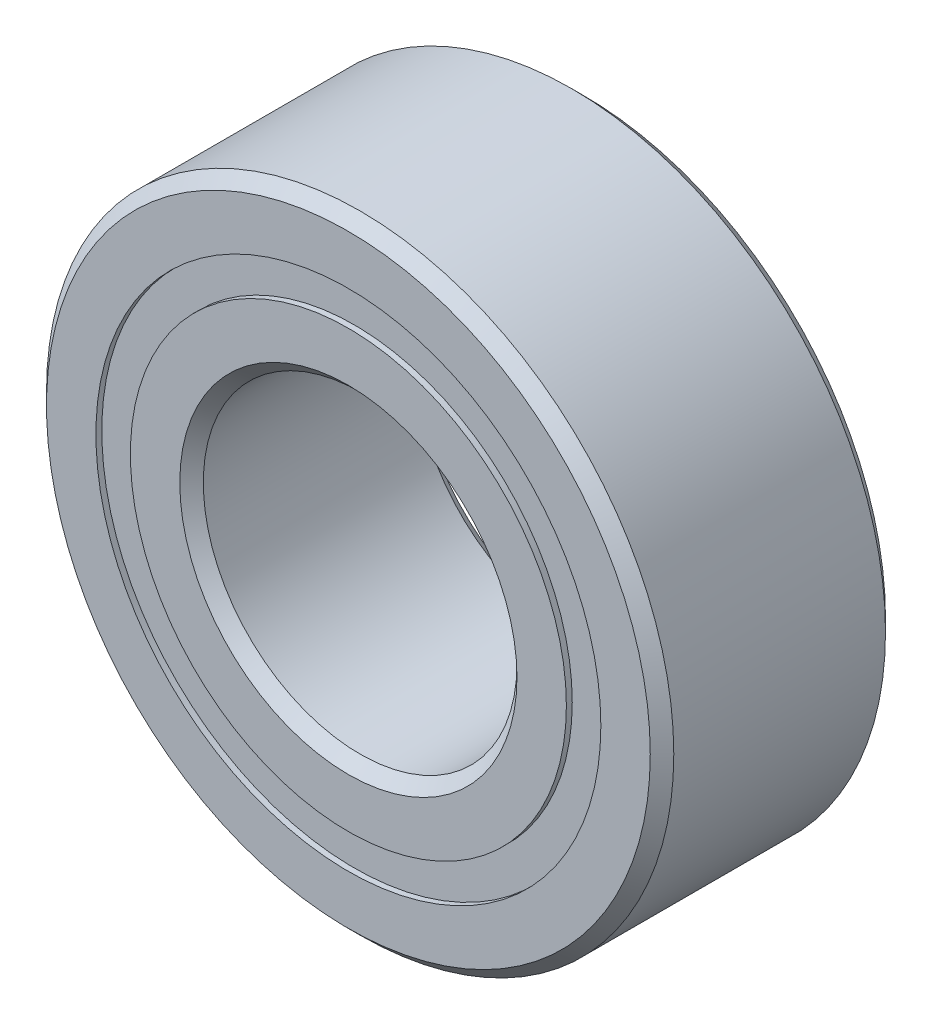
ISO-10303-21;
HEADER;
FILE_DESCRIPTION(('STEP AP214'),'2;1');
FILE_NAME('part.step','',(''),(''),'','','');
FILE_SCHEMA(('AUTOMOTIVE_DESIGN { 1 0 10303 214 1 1 1 1 }'));
ENDSEC;
DATA;
#1=APPLICATION_CONTEXT('core data for automotive mechanical design processes');
#2=APPLICATION_PROTOCOL_DEFINITION('international standard','automotive_design',2000,#1);
#3=PRODUCT_CONTEXT('',#1,'mechanical');
#4=PRODUCT('Part','Part','',(#3));
#5=PRODUCT_RELATED_PRODUCT_CATEGORY('part','',(#4));
#6=PRODUCT_DEFINITION_FORMATION('','',#4);
#7=PRODUCT_DEFINITION_CONTEXT('part definition',#1,'design');
#8=PRODUCT_DEFINITION('design','',#6,#7);
#9=PRODUCT_DEFINITION_SHAPE('','',#8);
#10=(LENGTH_UNIT() NAMED_UNIT(*) SI_UNIT(.MILLI.,.METRE.));
#11=(NAMED_UNIT(*) PLANE_ANGLE_UNIT() SI_UNIT($,.RADIAN.));
#12=(NAMED_UNIT(*) SI_UNIT($,.STERADIAN.) SOLID_ANGLE_UNIT());
#13=UNCERTAINTY_MEASURE_WITH_UNIT(LENGTH_MEASURE(1.E-05),#10,'distance_accuracy_value','');
#14=(GEOMETRIC_REPRESENTATION_CONTEXT(3) GLOBAL_UNCERTAINTY_ASSIGNED_CONTEXT((#13)) GLOBAL_UNIT_ASSIGNED_CONTEXT((#10,
#11,#12)) REPRESENTATION_CONTEXT('',''));
#15=CARTESIAN_POINT('',(0.,0.,0.));
#16=DIRECTION('',(0.,0.,1.));
#17=DIRECTION('',(1.,0.,0.));
#18=AXIS2_PLACEMENT_3D('',#15,#16,#17);
#19=CARTESIAN_POINT('',(0.,5.1114010989011,-2.2621875));
#20=DIRECTION('',(0.,0.,1.));
#21=DIRECTION('',(1.,0.,0.));
#22=AXIS2_PLACEMENT_3D('',#19,#20,#21);
#23=PLANE('',#22);
#24=CARTESIAN_POINT('',(0.,0.,-2.2621875));
#25=DIRECTION('',(0.,0.,1.));
#26=DIRECTION('',(1.,0.,0.));
#27=AXIS2_PLACEMENT_3D('',#24,#25,#26);
#28=CIRCLE('',#27,5.1114010989011);
#29=CARTESIAN_POINT('',(5.1114010989011,0.,-2.2621875));
#30=VERTEX_POINT('',#29);
#31=EDGE_CURVE('E64',#30,#30,#28,.T.);
#32=ORIENTED_EDGE('',*,*,#31,.F.);
#33=EDGE_LOOP('',(#32));
#34=FACE_BOUND('',#33,.T.);
#35=CARTESIAN_POINT('',(0.,0.,-2.2621875));
#36=DIRECTION('',(0.,0.,1.));
#37=DIRECTION('',(1.,0.,0.));
#38=AXIS2_PLACEMENT_3D('',#35,#36,#37);
#39=CIRCLE('',#38,4.4135989010989);
#40=CARTESIAN_POINT('',(4.4135989010989,0.,-2.2621875));
#41=VERTEX_POINT('',#40);
#42=EDGE_CURVE('E11',#41,#41,#39,.T.);
#43=ORIENTED_EDGE('',*,*,#42,.T.);
#44=EDGE_LOOP('',(#43));
#45=FACE_BOUND('',#44,.T.);
#46=ADVANCED_FACE('F50',(#34,#45),#23,.F.);
#47=CARTESIAN_POINT('',(0.,0.,2.38125));
#48=DIRECTION('',(0.,0.,1.));
#49=DIRECTION('',(1.,0.,0.));
#50=AXIS2_PLACEMENT_3D('',#47,#48,#49);
#51=CYLINDRICAL_SURFACE('',#50,4.4135989010989);
#52=ORIENTED_EDGE('',*,*,#42,.F.);
#53=EDGE_LOOP('',(#52));
#54=FACE_BOUND('',#53,.T.);
#55=CARTESIAN_POINT('',(0.,0.,-1.11436144103197));
#56=DIRECTION('',(0.,0.,1.));
#57=DIRECTION('',(1.,0.,0.));
#58=AXIS2_PLACEMENT_3D('',#55,#56,#57);
#59=CIRCLE('',#58,4.4135989010989);
#60=CARTESIAN_POINT('',(4.4135989010989,0.,-1.11436144103197));
#61=VERTEX_POINT('',#60);
#62=EDGE_CURVE('E56',#61,#61,#59,.T.);
#63=ORIENTED_EDGE('',*,*,#62,.T.);
#64=EDGE_LOOP('',(#63));
#65=FACE_BOUND('',#64,.T.);
#66=ADVANCED_FACE('F73',(#54,#65),#51,.F.);
#67=CARTESIAN_POINT('',(0.,5.1114010989011,-1.11436144103197));
#68=DIRECTION('',(0.,0.,-1.));
#69=DIRECTION('',(-1.,0.,0.));
#70=AXIS2_PLACEMENT_3D('',#67,#68,#69);
#71=PLANE('',#70);
#72=ORIENTED_EDGE('',*,*,#62,.F.);
#73=EDGE_LOOP('',(#72));
#74=FACE_BOUND('',#73,.T.);
#75=CARTESIAN_POINT('',(0.,0.,-1.11436144103197));
#76=DIRECTION('',(0.,0.,1.));
#77=DIRECTION('',(1.,0.,0.));
#78=AXIS2_PLACEMENT_3D('',#75,#76,#77);
#79=CIRCLE('',#78,5.1114010989011);
#80=CARTESIAN_POINT('',(5.1114010989011,0.,-1.11436144103197));
#81=VERTEX_POINT('',#80);
#82=EDGE_CURVE('E60',#81,#81,#79,.T.);
#83=ORIENTED_EDGE('',*,*,#82,.T.);
#84=EDGE_LOOP('',(#83));
#85=FACE_BOUND('',#84,.T.);
#86=ADVANCED_FACE('F77',(#74,#85),#71,.F.);
#87=CARTESIAN_POINT('',(0.,0.,2.38125));
#88=DIRECTION('',(0.,0.,1.));
#89=DIRECTION('',(1.,0.,0.));
#90=AXIS2_PLACEMENT_3D('',#87,#88,#89);
#91=CYLINDRICAL_SURFACE('',#90,5.1114010989011);
#92=ORIENTED_EDGE('',*,*,#82,.F.);
#93=EDGE_LOOP('',(#92));
#94=FACE_BOUND('',#93,.T.);
#95=ORIENTED_EDGE('',*,*,#31,.T.);
#96=EDGE_LOOP('',(#95));
#97=FACE_BOUND('',#96,.T.);
#98=ADVANCED_FACE('F70',(#94,#97),#91,.T.);
#99=CLOSED_SHELL('',(#46,#66,#86,#98));
#100=MANIFOLD_SOLID_BREP('B2',#99);
#101=CARTESIAN_POINT('',(0.,5.1114010989011,2.2621875));
#102=DIRECTION('',(0.,0.,-1.));
#103=DIRECTION('',(-1.,0.,0.));
#104=AXIS2_PLACEMENT_3D('',#101,#102,#103);
#105=PLANE('',#104);
#106=CARTESIAN_POINT('',(0.,0.,2.2621875));
#107=DIRECTION('',(0.,0.,1.));
#108=DIRECTION('',(1.,0.,0.));
#109=AXIS2_PLACEMENT_3D('',#106,#107,#108);
#110=CIRCLE('',#109,4.4135989010989);
#111=CARTESIAN_POINT('',(4.4135989010989,0.,2.2621875));
#112=VERTEX_POINT('',#111);
#113=EDGE_CURVE('E49',#112,#112,#110,.T.);
#114=ORIENTED_EDGE('',*,*,#113,.F.);
#115=EDGE_LOOP('',(#114));
#116=FACE_BOUND('',#115,.T.);
#117=CARTESIAN_POINT('',(0.,0.,2.2621875));
#118=DIRECTION('',(0.,0.,1.));
#119=DIRECTION('',(1.,0.,0.));
#120=AXIS2_PLACEMENT_3D('',#117,#118,#119);
#121=CIRCLE('',#120,5.1114010989011);
#122=CARTESIAN_POINT('',(5.1114010989011,0.,2.2621875));
#123=VERTEX_POINT('',#122);
#124=EDGE_CURVE('E124',#123,#123,#121,.T.);
#125=ORIENTED_EDGE('',*,*,#124,.T.);
#126=EDGE_LOOP('',(#125));
#127=FACE_BOUND('',#126,.T.);
#128=ADVANCED_FACE('F110',(#116,#127),#105,.F.);
#129=CARTESIAN_POINT('',(0.,0.,2.38125));
#130=DIRECTION('',(0.,0.,1.));
#131=DIRECTION('',(1.,0.,0.));
#132=AXIS2_PLACEMENT_3D('',#129,#130,#131);
#133=CYLINDRICAL_SURFACE('',#132,4.4135989010989);
#134=CARTESIAN_POINT('',(0.,0.,1.11436144103197));
#135=DIRECTION('',(0.,0.,1.));
#136=DIRECTION('',(1.,0.,0.));
#137=AXIS2_PLACEMENT_3D('',#134,#135,#136);
#138=CIRCLE('',#137,4.4135989010989);
#139=CARTESIAN_POINT('',(4.4135989010989,0.,1.11436144103197));
#140=VERTEX_POINT('',#139);
#141=EDGE_CURVE('E116',#140,#140,#138,.T.);
#142=ORIENTED_EDGE('',*,*,#141,.F.);
#143=EDGE_LOOP('',(#142));
#144=FACE_BOUND('',#143,.T.);
#145=ORIENTED_EDGE('',*,*,#113,.T.);
#146=EDGE_LOOP('',(#145));
#147=FACE_BOUND('',#146,.T.);
#148=ADVANCED_FACE('F139',(#144,#147),#133,.F.);
#149=CARTESIAN_POINT('',(0.,5.1114010989011,1.11436144103197));
#150=DIRECTION('',(0.,0.,1.));
#151=DIRECTION('',(1.,0.,0.));
#152=AXIS2_PLACEMENT_3D('',#149,#150,#151);
#153=PLANE('',#152);
#154=CARTESIAN_POINT('',(0.,0.,1.11436144103197));
#155=DIRECTION('',(0.,0.,1.));
#156=DIRECTION('',(1.,0.,0.));
#157=AXIS2_PLACEMENT_3D('',#154,#155,#156);
#158=CIRCLE('',#157,5.1114010989011);
#159=CARTESIAN_POINT('',(5.1114010989011,0.,1.11436144103197));
#160=VERTEX_POINT('',#159);
#161=EDGE_CURVE('E120',#160,#160,#158,.T.);
#162=ORIENTED_EDGE('',*,*,#161,.F.);
#163=EDGE_LOOP('',(#162));
#164=FACE_BOUND('',#163,.T.);
#165=ORIENTED_EDGE('',*,*,#141,.T.);
#166=EDGE_LOOP('',(#165));
#167=FACE_BOUND('',#166,.T.);
#168=ADVANCED_FACE('F134',(#164,#167),#153,.F.);
#169=CARTESIAN_POINT('',(0.,0.,2.38125));
#170=DIRECTION('',(0.,0.,1.));
#171=DIRECTION('',(1.,0.,0.));
#172=AXIS2_PLACEMENT_3D('',#169,#170,#171);
#173=CYLINDRICAL_SURFACE('',#172,5.1114010989011);
#174=ORIENTED_EDGE('',*,*,#124,.F.);
#175=EDGE_LOOP('',(#174));
#176=FACE_BOUND('',#175,.T.);
#177=ORIENTED_EDGE('',*,*,#161,.T.);
#178=EDGE_LOOP('',(#177));
#179=FACE_BOUND('',#178,.T.);
#180=ADVANCED_FACE('F131',(#176,#179),#173,.T.);
#181=CLOSED_SHELL('',(#128,#148,#168,#180));
#182=MANIFOLD_SOLID_BREP('B6',#181);
#183=CARTESIAN_POINT('',(-2.38124999999995,4.12444598552342,0.));
#184=DIRECTION('',(0.,0.,1.));
#185=DIRECTION('',(-0.499999999999989,0.866025403784445,0.));
#186=AXIS2_PLACEMENT_3D('',#183,#184,#185);
#187=SPHERICAL_SURFACE('',#186,1.11436144103197);
#188=CARTESIAN_POINT('',(-2.38124999999995,4.12444598552342,1.11436144103197));
#189=VERTEX_POINT('',#188);
#190=VERTEX_LOOP('',#189);
#191=FACE_BOUND('',#190,.T.);
#192=ADVANCED_FACE('F170',(#191),#187,.T.);
#193=CLOSED_SHELL('',(#192));
#194=MANIFOLD_SOLID_BREP('B44',#193);
#195=CARTESIAN_POINT('',(-4.12444598552336,2.38125000000005,0.));
#196=DIRECTION('',(0.,0.,1.));
#197=DIRECTION('',(-0.866025403784433,0.50000000000001,0.));
#198=AXIS2_PLACEMENT_3D('',#195,#196,#197);
#199=SPHERICAL_SURFACE('',#198,1.11436144103197);
#200=CARTESIAN_POINT('',(-4.12444598552336,2.38125000000005,1.11436144103197));
#201=VERTEX_POINT('',#200);
#202=VERTEX_LOOP('',#201);
#203=FACE_BOUND('',#202,.T.);
#204=ADVANCED_FACE('F193',(#203),#199,.T.);
#205=CLOSED_SHELL('',(#204));
#206=MANIFOLD_SOLID_BREP('B106',#205);
#207=CARTESIAN_POINT('',(-4.7625,0.,0.));
#208=DIRECTION('',(0.,0.,1.));
#209=DIRECTION('',(-1.,0.,0.));
#210=AXIS2_PLACEMENT_3D('',#207,#208,#209);
#211=SPHERICAL_SURFACE('',#210,1.11436144103197);
#212=CARTESIAN_POINT('',(-4.7625,0.,1.11436144103197));
#213=VERTEX_POINT('',#212);
#214=VERTEX_LOOP('',#213);
#215=FACE_BOUND('',#214,.T.);
#216=ADVANCED_FACE('F216',(#215),#211,.T.);
#217=CLOSED_SHELL('',(#216));
#218=MANIFOLD_SOLID_BREP('B166',#217);
#219=CARTESIAN_POINT('',(-4.12444598552341,-2.38124999999996,0.));
#220=DIRECTION('',(0.,0.,1.));
#221=DIRECTION('',(-0.866025403784443,-0.499999999999992,0.));
#222=AXIS2_PLACEMENT_3D('',#219,#220,#221);
#223=SPHERICAL_SURFACE('',#222,1.11436144103197);
#224=CARTESIAN_POINT('',(-4.12444598552341,-2.38124999999996,1.11436144103197));
#225=VERTEX_POINT('',#224);
#226=VERTEX_LOOP('',#225);
#227=FACE_BOUND('',#226,.T.);
#228=ADVANCED_FACE('F239',(#227),#223,.T.);
#229=CLOSED_SHELL('',(#228));
#230=MANIFOLD_SOLID_BREP('B189',#229);
#231=CARTESIAN_POINT('',(-2.38125000000003,-4.12444598552337,0.));
#232=DIRECTION('',(0.,0.,1.));
#233=DIRECTION('',(-0.500000000000007,-0.866025403784435,0.));
#234=AXIS2_PLACEMENT_3D('',#231,#232,#233);
#235=SPHERICAL_SURFACE('',#234,1.11436144103197);
#236=CARTESIAN_POINT('',(-2.38125000000003,-4.12444598552337,1.11436144103197));
#237=VERTEX_POINT('',#236);
#238=VERTEX_LOOP('',#237);
#239=FACE_BOUND('',#238,.T.);
#240=ADVANCED_FACE('F262',(#239),#235,.T.);
#241=CLOSED_SHELL('',(#240));
#242=MANIFOLD_SOLID_BREP('B212',#241);
#243=CARTESIAN_POINT('',(0.,-4.7625,0.));
#244=DIRECTION('',(0.,0.,1.));
#245=DIRECTION('',(0.,-1.,0.));
#246=AXIS2_PLACEMENT_3D('',#243,#244,#245);
#247=SPHERICAL_SURFACE('',#246,1.11436144103197);
#248=CARTESIAN_POINT('',(0.,-4.7625,1.11436144103197));
#249=VERTEX_POINT('',#248);
#250=VERTEX_LOOP('',#249);
#251=FACE_BOUND('',#250,.T.);
#252=ADVANCED_FACE('F285',(#251),#247,.T.);
#253=CLOSED_SHELL('',(#252));
#254=MANIFOLD_SOLID_BREP('B235',#253);
#255=CARTESIAN_POINT('',(2.38124999999998,-4.1244459855234,0.));
#256=DIRECTION('',(0.,0.,1.));
#257=DIRECTION('',(0.499999999999995,-0.866025403784442,0.));
#258=AXIS2_PLACEMENT_3D('',#255,#256,#257);
#259=SPHERICAL_SURFACE('',#258,1.11436144103197);
#260=CARTESIAN_POINT('',(2.38124999999998,-4.1244459855234,1.11436144103197));
#261=VERTEX_POINT('',#260);
#262=VERTEX_LOOP('',#261);
#263=FACE_BOUND('',#262,.T.);
#264=ADVANCED_FACE('F308',(#263),#259,.T.);
#265=CLOSED_SHELL('',(#264));
#266=MANIFOLD_SOLID_BREP('B258',#265);
#267=CARTESIAN_POINT('',(4.12444598552338,-2.38125000000002,0.));
#268=DIRECTION('',(0.,0.,1.));
#269=DIRECTION('',(0.866025403784436,-0.500000000000004,0.));
#270=AXIS2_PLACEMENT_3D('',#267,#268,#269);
#271=SPHERICAL_SURFACE('',#270,1.11436144103197);
#272=CARTESIAN_POINT('',(4.12444598552338,-2.38125000000002,1.11436144103197));
#273=VERTEX_POINT('',#272);
#274=VERTEX_LOOP('',#273);
#275=FACE_BOUND('',#274,.T.);
#276=ADVANCED_FACE('F331',(#275),#271,.T.);
#277=CLOSED_SHELL('',(#276));
#278=MANIFOLD_SOLID_BREP('B281',#277);
#279=CARTESIAN_POINT('',(4.7625,0.,0.));
#280=DIRECTION('',(0.,0.,1.));
#281=DIRECTION('',(1.,0.,0.));
#282=AXIS2_PLACEMENT_3D('',#279,#280,#281);
#283=SPHERICAL_SURFACE('',#282,1.11436144103197);
#284=CARTESIAN_POINT('',(4.7625,0.,1.11436144103197));
#285=VERTEX_POINT('',#284);
#286=VERTEX_LOOP('',#285);
#287=FACE_BOUND('',#286,.T.);
#288=ADVANCED_FACE('F354',(#287),#283,.T.);
#289=CLOSED_SHELL('',(#288));
#290=MANIFOLD_SOLID_BREP('B304',#289);
#291=CARTESIAN_POINT('',(4.12444598552339,2.38124999999999,0.));
#292=DIRECTION('',(0.,0.,1.));
#293=DIRECTION('',(0.86602540378444,0.499999999999998,0.));
#294=AXIS2_PLACEMENT_3D('',#291,#292,#293);
#295=SPHERICAL_SURFACE('',#294,1.11436144103197);
#296=CARTESIAN_POINT('',(4.12444598552339,2.38124999999999,1.11436144103197));
#297=VERTEX_POINT('',#296);
#298=VERTEX_LOOP('',#297);
#299=FACE_BOUND('',#298,.T.);
#300=ADVANCED_FACE('F377',(#299),#295,.T.);
#301=CLOSED_SHELL('',(#300));
#302=MANIFOLD_SOLID_BREP('B327',#301);
#303=CARTESIAN_POINT('',(2.38125,4.12444598552339,0.));
#304=DIRECTION('',(0.,0.,1.));
#305=DIRECTION('',(0.500000000000001,0.866025403784438,0.));
#306=AXIS2_PLACEMENT_3D('',#303,#304,#305);
#307=SPHERICAL_SURFACE('',#306,1.11436144103197);
#308=CARTESIAN_POINT('',(2.38125,4.12444598552339,1.11436144103197));
#309=VERTEX_POINT('',#308);
#310=VERTEX_LOOP('',#309);
#311=FACE_BOUND('',#310,.T.);
#312=ADVANCED_FACE('F400',(#311),#307,.T.);
#313=CLOSED_SHELL('',(#312));
#314=MANIFOLD_SOLID_BREP('B350',#313);
#315=CARTESIAN_POINT('',(0.,4.7625,0.));
#316=DIRECTION('',(0.,0.,1.));
#317=DIRECTION('',(0.,1.,0.));
#318=AXIS2_PLACEMENT_3D('',#315,#316,#317);
#319=SPHERICAL_SURFACE('',#318,1.11436144103197);
#320=CARTESIAN_POINT('',(0.,4.7625,1.11436144103197));
#321=VERTEX_POINT('',#320);
#322=VERTEX_LOOP('',#321);
#323=FACE_BOUND('',#322,.T.);
#324=ADVANCED_FACE('F425',(#323),#319,.T.);
#325=CLOSED_SHELL('',(#324));
#326=MANIFOLD_SOLID_BREP('B373',#325);
#327=CARTESIAN_POINT('',(0.,4.4135989010989,2.38125));
#328=DIRECTION('',(0.,0.,-1.));
#329=DIRECTION('',(-1.,0.,0.));
#330=AXIS2_PLACEMENT_3D('',#327,#328,#329);
#331=PLANE('',#330);
#332=CARTESIAN_POINT('',(0.,0.,2.38125));
#333=DIRECTION('',(0.,0.,1.));
#334=DIRECTION('',(1.,0.,0.));
#335=AXIS2_PLACEMENT_3D('',#332,#333,#334);
#336=CIRCLE('',#335,3.413125);
#337=CARTESIAN_POINT('',(3.413125,0.,2.38125));
#338=VERTEX_POINT('',#337);
#339=EDGE_CURVE('E471',#338,#338,#336,.T.);
#340=ORIENTED_EDGE('',*,*,#339,.F.);
#341=EDGE_LOOP('',(#340));
#342=FACE_BOUND('',#341,.T.);
#343=CARTESIAN_POINT('',(0.,0.,2.38125));
#344=DIRECTION('',(0.,0.,1.));
#345=DIRECTION('',(1.,0.,0.));
#346=AXIS2_PLACEMENT_3D('',#343,#344,#345);
#347=CIRCLE('',#346,4.4135989010989);
#348=CARTESIAN_POINT('',(4.4135989010989,0.,2.38125));
#349=VERTEX_POINT('',#348);
#350=EDGE_CURVE('E424',#349,#349,#347,.T.);
#351=ORIENTED_EDGE('',*,*,#350,.T.);
#352=EDGE_LOOP('',(#351));
#353=FACE_BOUND('',#352,.T.);
#354=ADVANCED_FACE('F443',(#342,#353),#331,.F.);
#355=CARTESIAN_POINT('',(0.,0.,2.38125));
#356=DIRECTION('',(0.,0.,1.));
#357=DIRECTION('',(1.,0.,0.));
#358=AXIS2_PLACEMENT_3D('',#355,#356,#357);
#359=CYLINDRICAL_SURFACE('',#358,4.4135989010989);
#360=ORIENTED_EDGE('',*,*,#350,.F.);
#361=EDGE_LOOP('',(#360));
#362=FACE_BOUND('',#361,.T.);
#363=CARTESIAN_POINT('',(0.,0.,1.05833333333333));
#364=DIRECTION('',(0.,0.,1.));
#365=DIRECTION('',(1.,0.,0.));
#366=AXIS2_PLACEMENT_3D('',#363,#364,#365);
#367=CIRCLE('',#366,4.4135989010989);
#368=CARTESIAN_POINT('',(4.4135989010989,0.,1.05833333333333));
#369=VERTEX_POINT('',#368);
#370=EDGE_CURVE('E449',#369,#369,#367,.T.);
#371=ORIENTED_EDGE('',*,*,#370,.T.);
#372=EDGE_LOOP('',(#371));
#373=FACE_BOUND('',#372,.T.);
#374=ADVANCED_FACE('F478',(#362,#373),#359,.T.);
#375=CARTESIAN_POINT('',(0.,0.,0.));
#376=DIRECTION('',(0.,0.,1.));
#377=DIRECTION('',(1.,0.,0.));
#378=AXIS2_PLACEMENT_3D('',#375,#376,#377);
#379=TOROIDAL_SURFACE('',#378,4.76249999999999,1.11436144103196);
#380=ORIENTED_EDGE('',*,*,#370,.F.);
#381=EDGE_LOOP('',(#380));
#382=FACE_BOUND('',#381,.T.);
#383=CARTESIAN_POINT('',(0.,0.,-1.05833333333334));
#384=DIRECTION('',(0.,0.,1.));
#385=DIRECTION('',(1.,0.,0.));
#386=AXIS2_PLACEMENT_3D('',#383,#384,#385);
#387=CIRCLE('',#386,4.4135989010989);
#388=CARTESIAN_POINT('',(4.4135989010989,0.,-1.05833333333334));
#389=VERTEX_POINT('',#388);
#390=EDGE_CURVE('E453',#389,#389,#387,.T.);
#391=ORIENTED_EDGE('',*,*,#390,.T.);
#392=EDGE_LOOP('',(#391));
#393=FACE_BOUND('',#392,.T.);
#394=ADVANCED_FACE('F482',(#382,#393),#379,.F.);
#395=CARTESIAN_POINT('',(0.,0.,2.38125));
#396=DIRECTION('',(0.,0.,1.));
#397=DIRECTION('',(1.,0.,0.));
#398=AXIS2_PLACEMENT_3D('',#395,#396,#397);
#399=CYLINDRICAL_SURFACE('',#398,4.4135989010989);
#400=ORIENTED_EDGE('',*,*,#390,.F.);
#401=EDGE_LOOP('',(#400));
#402=FACE_BOUND('',#401,.T.);
#403=CARTESIAN_POINT('',(0.,0.,-2.38125));
#404=DIRECTION('',(0.,0.,1.));
#405=DIRECTION('',(1.,0.,0.));
#406=AXIS2_PLACEMENT_3D('',#403,#404,#405);
#407=CIRCLE('',#406,4.4135989010989);
#408=CARTESIAN_POINT('',(4.4135989010989,0.,-2.38125));
#409=VERTEX_POINT('',#408);
#410=EDGE_CURVE('E457',#409,#409,#407,.T.);
#411=ORIENTED_EDGE('',*,*,#410,.T.);
#412=EDGE_LOOP('',(#411));
#413=FACE_BOUND('',#412,.T.);
#414=ADVANCED_FACE('F487',(#402,#413),#399,.T.);
#415=CARTESIAN_POINT('',(0.,3.413125,-2.38125));
#416=DIRECTION('',(0.,0.,1.));
#417=DIRECTION('',(1.,0.,0.));
#418=AXIS2_PLACEMENT_3D('',#415,#416,#417);
#419=PLANE('',#418);
#420=ORIENTED_EDGE('',*,*,#410,.F.);
#421=EDGE_LOOP('',(#420));
#422=FACE_BOUND('',#421,.T.);
#423=CARTESIAN_POINT('',(0.,0.,-2.38125));
#424=DIRECTION('',(0.,0.,1.));
#425=DIRECTION('',(1.,0.,0.));
#426=AXIS2_PLACEMENT_3D('',#423,#424,#425);
#427=CIRCLE('',#426,3.413125);
#428=CARTESIAN_POINT('',(3.413125,0.,-2.38125));
#429=VERTEX_POINT('',#428);
#430=EDGE_CURVE('E462',#429,#429,#427,.T.);
#431=ORIENTED_EDGE('',*,*,#430,.T.);
#432=EDGE_LOOP('',(#431));
#433=FACE_BOUND('',#432,.T.);
#434=ADVANCED_FACE('F493',(#422,#433),#419,.F.);
#435=CARTESIAN_POINT('',(0.,0.,-2.143125));
#436=DIRECTION('',(0.,0.,-1.));
#437=DIRECTION('',(-1.,0.,0.));
#438=AXIS2_PLACEMENT_3D('',#435,#436,#437);
#439=CONICAL_SURFACE('',#438,3.175,0.785398163397451);
#440=ORIENTED_EDGE('',*,*,#430,.F.);
#441=EDGE_LOOP('',(#440));
#442=FACE_BOUND('',#441,.T.);
#443=CARTESIAN_POINT('',(0.,0.,-2.143125));
#444=DIRECTION('',(0.,0.,1.));
#445=DIRECTION('',(1.,0.,0.));
#446=AXIS2_PLACEMENT_3D('',#443,#444,#445);
#447=CIRCLE('',#446,3.175);
#448=CARTESIAN_POINT('',(3.175,0.,-2.143125));
#449=VERTEX_POINT('',#448);
#450=EDGE_CURVE('E465',#449,#449,#447,.T.);
#451=ORIENTED_EDGE('',*,*,#450,.T.);
#452=EDGE_LOOP('',(#451));
#453=FACE_BOUND('',#452,.T.);
#454=ADVANCED_FACE('F497',(#442,#453),#439,.F.);
#455=CARTESIAN_POINT('',(0.,0.,2.38125));
#456=DIRECTION('',(0.,0.,1.));
#457=DIRECTION('',(1.,0.,0.));
#458=AXIS2_PLACEMENT_3D('',#455,#456,#457);
#459=CYLINDRICAL_SURFACE('',#458,3.175);
#460=ORIENTED_EDGE('',*,*,#450,.F.);
#461=EDGE_LOOP('',(#460));
#462=FACE_BOUND('',#461,.T.);
#463=CARTESIAN_POINT('',(0.,0.,2.143125));
#464=DIRECTION('',(0.,0.,1.));
#465=DIRECTION('',(1.,0.,0.));
#466=AXIS2_PLACEMENT_3D('',#463,#464,#465);
#467=CIRCLE('',#466,3.175);
#468=CARTESIAN_POINT('',(3.175,0.,2.143125));
#469=VERTEX_POINT('',#468);
#470=EDGE_CURVE('E468',#469,#469,#467,.T.);
#471=ORIENTED_EDGE('',*,*,#470,.T.);
#472=EDGE_LOOP('',(#471));
#473=FACE_BOUND('',#472,.T.);
#474=ADVANCED_FACE('F501',(#462,#473),#459,.F.);
#475=CARTESIAN_POINT('',(0.,0.,2.38125));
#476=DIRECTION('',(0.,0.,1.));
#477=DIRECTION('',(1.,0.,0.));
#478=AXIS2_PLACEMENT_3D('',#475,#476,#477);
#479=CONICAL_SURFACE('',#478,3.413125,0.785398163397446);
#480=ORIENTED_EDGE('',*,*,#470,.F.);
#481=EDGE_LOOP('',(#480));
#482=FACE_BOUND('',#481,.T.);
#483=ORIENTED_EDGE('',*,*,#339,.T.);
#484=EDGE_LOOP('',(#483));
#485=FACE_BOUND('',#484,.T.);
#486=ADVANCED_FACE('F475',(#482,#485),#479,.F.);
#487=CLOSED_SHELL('',(#354,#374,#394,#414,#434,#454,#474,#486));
#488=MANIFOLD_SOLID_BREP('B396',#487);
#489=CARTESIAN_POINT('',(0.,0.,2.143125));
#490=DIRECTION('',(0.,0.,-1.));
#491=DIRECTION('',(-1.,0.,0.));
#492=AXIS2_PLACEMENT_3D('',#489,#490,#491);
#493=CONICAL_SURFACE('',#492,6.35,0.785398163397447);
#494=CARTESIAN_POINT('',(0.,0.,2.38125));
#495=DIRECTION('',(0.,0.,1.));
#496=DIRECTION('',(1.,0.,0.));
#497=AXIS2_PLACEMENT_3D('',#494,#495,#496);
#498=CIRCLE('',#497,6.111875);
#499=CARTESIAN_POINT('',(6.111875,0.,2.38125));
#500=VERTEX_POINT('',#499);
#501=EDGE_CURVE('E577',#500,#500,#498,.T.);
#502=ORIENTED_EDGE('',*,*,#501,.F.);
#503=EDGE_LOOP('',(#502));
#504=FACE_BOUND('',#503,.T.);
#505=CARTESIAN_POINT('',(0.,0.,2.143125));
#506=DIRECTION('',(0.,0.,1.));
#507=DIRECTION('',(1.,0.,0.));
#508=AXIS2_PLACEMENT_3D('',#505,#506,#507);
#509=CIRCLE('',#508,6.35);
#510=CARTESIAN_POINT('',(6.35,0.,2.143125));
#511=VERTEX_POINT('',#510);
#512=EDGE_CURVE('E442',#511,#511,#509,.T.);
#513=ORIENTED_EDGE('',*,*,#512,.T.);
#514=EDGE_LOOP('',(#513));
#515=FACE_BOUND('',#514,.T.);
#516=ADVANCED_FACE('F549',(#504,#515),#493,.T.);
#517=CARTESIAN_POINT('',(0.,0.,2.38125));
#518=DIRECTION('',(0.,0.,1.));
#519=DIRECTION('',(1.,0.,0.));
#520=AXIS2_PLACEMENT_3D('',#517,#518,#519);
#521=CYLINDRICAL_SURFACE('',#520,6.35);
#522=ORIENTED_EDGE('',*,*,#512,.F.);
#523=EDGE_LOOP('',(#522));
#524=FACE_BOUND('',#523,.T.);
#525=CARTESIAN_POINT('',(0.,0.,-2.143125));
#526=DIRECTION('',(0.,0.,1.));
#527=DIRECTION('',(1.,0.,0.));
#528=AXIS2_PLACEMENT_3D('',#525,#526,#527);
#529=CIRCLE('',#528,6.35);
#530=CARTESIAN_POINT('',(6.35,0.,-2.143125));
#531=VERTEX_POINT('',#530);
#532=EDGE_CURVE('E555',#531,#531,#529,.T.);
#533=ORIENTED_EDGE('',*,*,#532,.T.);
#534=EDGE_LOOP('',(#533));
#535=FACE_BOUND('',#534,.T.);
#536=ADVANCED_FACE('F584',(#524,#535),#521,.T.);
#537=CARTESIAN_POINT('',(0.,0.,-2.38125));
#538=DIRECTION('',(0.,0.,1.));
#539=DIRECTION('',(1.,0.,0.));
#540=AXIS2_PLACEMENT_3D('',#537,#538,#539);
#541=CONICAL_SURFACE('',#540,6.111875,0.785398163397447);
#542=ORIENTED_EDGE('',*,*,#532,.F.);
#543=EDGE_LOOP('',(#542));
#544=FACE_BOUND('',#543,.T.);
#545=CARTESIAN_POINT('',(0.,0.,-2.38125));
#546=DIRECTION('',(0.,0.,1.));
#547=DIRECTION('',(1.,0.,0.));
#548=AXIS2_PLACEMENT_3D('',#545,#546,#547);
#549=CIRCLE('',#548,6.111875);
#550=CARTESIAN_POINT('',(6.111875,0.,-2.38125));
#551=VERTEX_POINT('',#550);
#552=EDGE_CURVE('E559',#551,#551,#549,.T.);
#553=ORIENTED_EDGE('',*,*,#552,.T.);
#554=EDGE_LOOP('',(#553));
#555=FACE_BOUND('',#554,.T.);
#556=ADVANCED_FACE('F588',(#544,#555),#541,.T.);
#557=CARTESIAN_POINT('',(0.,6.111875,-2.38125));
#558=DIRECTION('',(0.,0.,1.));
#559=DIRECTION('',(1.,0.,0.));
#560=AXIS2_PLACEMENT_3D('',#557,#558,#559);
#561=PLANE('',#560);
#562=ORIENTED_EDGE('',*,*,#552,.F.);
#563=EDGE_LOOP('',(#562));
#564=FACE_BOUND('',#563,.T.);
#565=CARTESIAN_POINT('',(0.,0.,-2.38125));
#566=DIRECTION('',(0.,0.,1.));
#567=DIRECTION('',(1.,0.,0.));
#568=AXIS2_PLACEMENT_3D('',#565,#566,#567);
#569=CIRCLE('',#568,5.1114010989011);
#570=CARTESIAN_POINT('',(5.1114010989011,0.,-2.38125));
#571=VERTEX_POINT('',#570);
#572=EDGE_CURVE('E563',#571,#571,#569,.T.);
#573=ORIENTED_EDGE('',*,*,#572,.T.);
#574=EDGE_LOOP('',(#573));
#575=FACE_BOUND('',#574,.T.);
#576=ADVANCED_FACE('F593',(#564,#575),#561,.F.);
#577=CARTESIAN_POINT('',(0.,0.,2.38125));
#578=DIRECTION('',(0.,0.,1.));
#579=DIRECTION('',(1.,0.,0.));
#580=AXIS2_PLACEMENT_3D('',#577,#578,#579);
#581=CYLINDRICAL_SURFACE('',#580,5.1114010989011);
#582=ORIENTED_EDGE('',*,*,#572,.F.);
#583=EDGE_LOOP('',(#582));
#584=FACE_BOUND('',#583,.T.);
#585=CARTESIAN_POINT('',(0.,0.,-1.05833333333333));
#586=DIRECTION('',(0.,0.,1.));
#587=DIRECTION('',(1.,0.,0.));
#588=AXIS2_PLACEMENT_3D('',#585,#586,#587);
#589=CIRCLE('',#588,5.1114010989011);
#590=CARTESIAN_POINT('',(5.1114010989011,0.,-1.05833333333333));
#591=VERTEX_POINT('',#590);
#592=EDGE_CURVE('E568',#591,#591,#589,.T.);
#593=ORIENTED_EDGE('',*,*,#592,.T.);
#594=EDGE_LOOP('',(#593));
#595=FACE_BOUND('',#594,.T.);
#596=ADVANCED_FACE('F599',(#584,#595),#581,.F.);
#597=CARTESIAN_POINT('',(0.,0.,0.));
#598=DIRECTION('',(0.,0.,1.));
#599=DIRECTION('',(1.,0.,0.));
#600=AXIS2_PLACEMENT_3D('',#597,#598,#599);
#601=TOROIDAL_SURFACE('',#600,4.7625,1.11436144103197);
#602=ORIENTED_EDGE('',*,*,#592,.F.);
#603=EDGE_LOOP('',(#602));
#604=FACE_BOUND('',#603,.T.);
#605=CARTESIAN_POINT('',(0.,0.,1.05833333333333));
#606=DIRECTION('',(0.,0.,1.));
#607=DIRECTION('',(1.,0.,0.));
#608=AXIS2_PLACEMENT_3D('',#605,#606,#607);
#609=CIRCLE('',#608,5.1114010989011);
#610=CARTESIAN_POINT('',(5.1114010989011,0.,1.05833333333333));
#611=VERTEX_POINT('',#610);
#612=EDGE_CURVE('E571',#611,#611,#609,.T.);
#613=ORIENTED_EDGE('',*,*,#612,.T.);
#614=EDGE_LOOP('',(#613));
#615=FACE_BOUND('',#614,.T.);
#616=ADVANCED_FACE('F603',(#604,#615),#601,.F.);
#617=CARTESIAN_POINT('',(0.,0.,2.38125));
#618=DIRECTION('',(0.,0.,1.));
#619=DIRECTION('',(1.,0.,0.));
#620=AXIS2_PLACEMENT_3D('',#617,#618,#619);
#621=CYLINDRICAL_SURFACE('',#620,5.1114010989011);
#622=ORIENTED_EDGE('',*,*,#612,.F.);
#623=EDGE_LOOP('',(#622));
#624=FACE_BOUND('',#623,.T.);
#625=CARTESIAN_POINT('',(0.,0.,2.38125));
#626=DIRECTION('',(0.,0.,1.));
#627=DIRECTION('',(1.,0.,0.));
#628=AXIS2_PLACEMENT_3D('',#625,#626,#627);
#629=CIRCLE('',#628,5.1114010989011);
#630=CARTESIAN_POINT('',(5.1114010989011,0.,2.38125));
#631=VERTEX_POINT('',#630);
#632=EDGE_CURVE('E574',#631,#631,#629,.T.);
#633=ORIENTED_EDGE('',*,*,#632,.T.);
#634=EDGE_LOOP('',(#633));
#635=FACE_BOUND('',#634,.T.);
#636=ADVANCED_FACE('F607',(#624,#635),#621,.F.);
#637=CARTESIAN_POINT('',(0.,6.111875,2.38125));
#638=DIRECTION('',(0.,0.,-1.));
#639=DIRECTION('',(-1.,0.,0.));
#640=AXIS2_PLACEMENT_3D('',#637,#638,#639);
#641=PLANE('',#640);
#642=ORIENTED_EDGE('',*,*,#632,.F.);
#643=EDGE_LOOP('',(#642));
#644=FACE_BOUND('',#643,.T.);
#645=ORIENTED_EDGE('',*,*,#501,.T.);
#646=EDGE_LOOP('',(#645));
#647=FACE_BOUND('',#646,.T.);
#648=ADVANCED_FACE('F581',(#644,#647),#641,.F.);
#649=CLOSED_SHELL('',(#516,#536,#556,#576,#596,#616,#636,#648));
#650=MANIFOLD_SOLID_BREP('B419',#649);
#651=ADVANCED_BREP_SHAPE_REPRESENTATION('',(#18,#100,#182,#194,#206,#218,#230,#242,#254,#266,
#278,#290,#302,#314,#326,#488,#650),#14);
#652=SHAPE_DEFINITION_REPRESENTATION(#9,#651);
ENDSEC;
END-ISO-10303-21;
